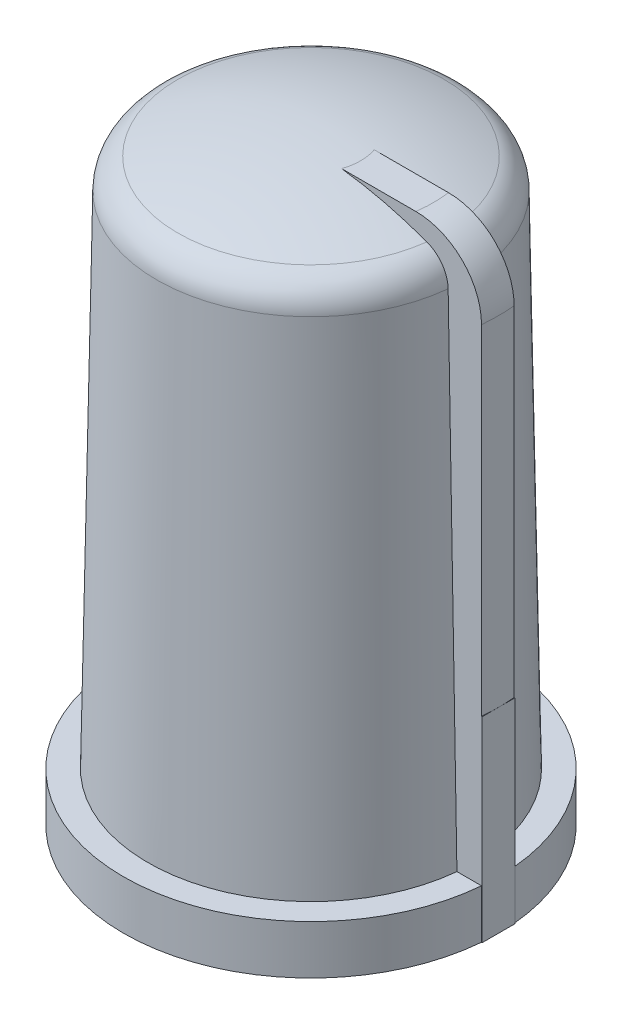
ISO-10303-21;
HEADER;
FILE_DESCRIPTION(('STEP AP214'),'2;1');
FILE_NAME('part.step','',(''),(''),'','','');
FILE_SCHEMA(('AUTOMOTIVE_DESIGN { 1 0 10303 214 1 1 1 1 }'));
ENDSEC;
DATA;
#1=APPLICATION_CONTEXT('core data for automotive mechanical design processes');
#2=APPLICATION_PROTOCOL_DEFINITION('international standard','automotive_design',2000,#1);
#3=PRODUCT_CONTEXT('',#1,'mechanical');
#4=PRODUCT('Part','Part','',(#3));
#5=PRODUCT_RELATED_PRODUCT_CATEGORY('part','',(#4));
#6=PRODUCT_DEFINITION_FORMATION('','',#4);
#7=PRODUCT_DEFINITION_CONTEXT('part definition',#1,'design');
#8=PRODUCT_DEFINITION('design','',#6,#7);
#9=PRODUCT_DEFINITION_SHAPE('','',#8);
#10=(LENGTH_UNIT() NAMED_UNIT(*) SI_UNIT(.MILLI.,.METRE.));
#11=(NAMED_UNIT(*) PLANE_ANGLE_UNIT() SI_UNIT($,.RADIAN.));
#12=(NAMED_UNIT(*) SI_UNIT($,.STERADIAN.) SOLID_ANGLE_UNIT());
#13=UNCERTAINTY_MEASURE_WITH_UNIT(LENGTH_MEASURE(1.E-05),#10,'distance_accuracy_value','');
#14=(GEOMETRIC_REPRESENTATION_CONTEXT(3) GLOBAL_UNCERTAINTY_ASSIGNED_CONTEXT((#13)) GLOBAL_UNIT_ASSIGNED_CONTEXT((#10,
#11,#12)) REPRESENTATION_CONTEXT('',''));
#15=CARTESIAN_POINT('',(0.,0.,0.));
#16=DIRECTION('',(0.,0.,1.));
#17=DIRECTION('',(1.,0.,0.));
#18=AXIS2_PLACEMENT_3D('',#15,#16,#17);
#19=CARTESIAN_POINT('',(0.,1.5,0.));
#20=DIRECTION('',(0.,-1.,0.));
#21=DIRECTION('',(0.,0.,-1.));
#22=AXIS2_PLACEMENT_3D('',#19,#20,#21);
#23=CYLINDRICAL_SURFACE('',#22,5.75);
#24=DIRECTION('',(0.,-1.,0.));
#25=VECTOR('',#24,1.);
#26=CARTESIAN_POINT('',(5.7282196186948,1.5,0.5));
#27=LINE('',#26,#25);
#28=CARTESIAN_POINT('',(5.7282196186948,6.,0.5));
#29=VERTEX_POINT('',#28);
#30=CARTESIAN_POINT('',(5.7282196186948,16.4,0.5));
#31=VERTEX_POINT('',#30);
#32=EDGE_CURVE('E183',#29,#31,#27,.F.);
#33=ORIENTED_EDGE('',*,*,#32,.F.);
#34=CARTESIAN_POINT('',(0.,6.,0.));
#35=DIRECTION('',(0.,1.,0.));
#36=DIRECTION('',(0.,0.,1.));
#37=AXIS2_PLACEMENT_3D('',#34,#35,#36);
#38=CIRCLE('',#37,5.75);
#39=CARTESIAN_POINT('',(5.75,6.,0.));
#40=VERTEX_POINT('',#39);
#41=EDGE_CURVE('E140',#29,#40,#38,.T.);
#42=ORIENTED_EDGE('',*,*,#41,.T.);
#43=CARTESIAN_POINT('',(5.7282196186948,6.,-0.500000000000001));
#44=VERTEX_POINT('',#43);
#45=EDGE_CURVE('E165',#40,#44,#38,.T.);
#46=ORIENTED_EDGE('',*,*,#45,.T.);
#47=DIRECTION('',(0.,-1.,0.));
#48=VECTOR('',#47,1.);
#49=CARTESIAN_POINT('',(5.7282196186948,1.5,-0.500000000000001));
#50=LINE('',#49,#48);
#51=CARTESIAN_POINT('',(5.7282196186948,16.4,-0.500000000000001));
#52=VERTEX_POINT('',#51);
#53=EDGE_CURVE('E180',#52,#44,#50,.T.);
#54=ORIENTED_EDGE('',*,*,#53,.F.);
#55=CARTESIAN_POINT('',(0.,16.4,0.));
#56=DIRECTION('',(0.,-1.,0.));
#57=DIRECTION('',(0.,0.,-1.));
#58=AXIS2_PLACEMENT_3D('',#55,#56,#57);
#59=CIRCLE('',#58,5.75);
#60=EDGE_CURVE('E249',#52,#31,#59,.T.);
#61=ORIENTED_EDGE('',*,*,#60,.T.);
#62=EDGE_LOOP('',(#33,#42,#46,#54,#61));
#63=FACE_BOUND('',#62,.T.);
#64=ADVANCED_FACE('F36',(#63),#23,.T.);
#65=CARTESIAN_POINT('',(0.,1.5,0.));
#66=DIRECTION('',(0.,1.,0.));
#67=DIRECTION('',(0.,0.,1.));
#68=AXIS2_PLACEMENT_3D('',#65,#66,#67);
#69=PLANE('',#68);
#70=CARTESIAN_POINT('',(0.,1.5,0.));
#71=DIRECTION('',(0.,1.,0.));
#72=DIRECTION('',(0.,0.,1.));
#73=AXIS2_PLACEMENT_3D('',#70,#71,#72);
#74=CIRCLE('',#73,5.);
#75=CARTESIAN_POINT('',(4.9749371855331,1.5,-0.500000000000001));
#76=VERTEX_POINT('',#75);
#77=CARTESIAN_POINT('',(4.9749371855331,1.5,0.5));
#78=VERTEX_POINT('',#77);
#79=EDGE_CURVE('E275',#76,#78,#74,.T.);
#80=ORIENTED_EDGE('',*,*,#79,.F.);
#81=DIRECTION('',(-1.,0.,0.));
#82=VECTOR('',#81,1.);
#83=CARTESIAN_POINT('',(5.751,1.5,-0.500000000000001));
#84=LINE('',#83,#82);
#85=CARTESIAN_POINT('',(5.7282196186948,1.5,-0.500000000000001));
#86=VERTEX_POINT('',#85);
#87=EDGE_CURVE('E190',#86,#76,#84,.T.);
#88=ORIENTED_EDGE('',*,*,#87,.F.);
#89=CARTESIAN_POINT('',(0.,1.5,0.));
#90=DIRECTION('',(0.,1.,0.));
#91=DIRECTION('',(0.,0.,1.));
#92=AXIS2_PLACEMENT_3D('',#89,#90,#91);
#93=CIRCLE('',#92,5.75);
#94=CARTESIAN_POINT('',(5.7282196186948,1.5,0.5));
#95=VERTEX_POINT('',#94);
#96=EDGE_CURVE('E266',#86,#95,#93,.T.);
#97=ORIENTED_EDGE('',*,*,#96,.T.);
#98=DIRECTION('',(-1.,0.,0.));
#99=VECTOR('',#98,1.);
#100=CARTESIAN_POINT('',(5.751,1.5,0.5));
#101=LINE('',#100,#99);
#102=EDGE_CURVE('E184',#95,#78,#101,.T.);
#103=ORIENTED_EDGE('',*,*,#102,.T.);
#104=EDGE_LOOP('',(#80,#88,#97,#103));
#105=FACE_BOUND('',#104,.T.);
#106=ADVANCED_FACE('F274',(#105),#69,.T.);
#107=CARTESIAN_POINT('',(0.,6.85740624492644,0.));
#108=DIRECTION('',(0.,0.,1.));
#109=DIRECTION('',(1.,0.,0.));
#110=AXIS2_PLACEMENT_3D('',#107,#108,#109);
#111=SPHERICAL_SURFACE('',#110,11.6425937550736);
#112=CARTESIAN_POINT('',(0.,18.4,0.));
#113=DIRECTION('',(0.,-1.,0.));
#114=DIRECTION('',(0.,0.,-1.));
#115=AXIS2_PLACEMENT_3D('',#112,#113,#114);
#116=CIRCLE('',#115,1.52266829973396);
#117=CARTESIAN_POINT('',(1.43823459526415,18.4,0.500000000000001));
#118=VERTEX_POINT('',#117);
#119=CARTESIAN_POINT('',(1.43823459526415,18.4,-0.499999999999999));
#120=VERTEX_POINT('',#119);
#121=EDGE_CURVE('E323',#118,#120,#116,.F.);
#122=ORIENTED_EDGE('',*,*,#121,.T.);
#123=CARTESIAN_POINT('',(0.,6.85740624492644,-0.5));
#124=DIRECTION('',(0.,0.,1.));
#125=DIRECTION('',(0.,-1.,0.));
#126=AXIS2_PLACEMENT_3D('',#123,#124,#125);
#127=CIRCLE('',#126,11.6318523608958);
#128=CARTESIAN_POINT('',(4.05233596992253,17.7605508616209,-0.499999999999999));
#129=VERTEX_POINT('',#128);
#130=EDGE_CURVE('E223',#120,#129,#127,.F.);
#131=ORIENTED_EDGE('',*,*,#130,.T.);
#132=CARTESIAN_POINT('',(0.,17.7605508616208,0.));
#133=DIRECTION('',(0.,-1.,0.));
#134=DIRECTION('',(0.,0.,-1.));
#135=AXIS2_PLACEMENT_3D('',#132,#133,#134);
#136=CIRCLE('',#135,4.08306585951384);
#137=CARTESIAN_POINT('',(4.05233596992247,17.7605508616208,0.500000000000001));
#138=VERTEX_POINT('',#137);
#139=EDGE_CURVE('E277',#129,#138,#136,.F.);
#140=ORIENTED_EDGE('',*,*,#139,.T.);
#141=CARTESIAN_POINT('',(0.,6.85740624492644,0.5));
#142=DIRECTION('',(0.,0.,-1.));
#143=DIRECTION('',(0.,1.,0.));
#144=AXIS2_PLACEMENT_3D('',#141,#142,#143);
#145=CIRCLE('',#144,11.6318523608958);
#146=EDGE_CURVE('E201',#138,#118,#145,.F.);
#147=ORIENTED_EDGE('',*,*,#146,.T.);
#148=EDGE_LOOP('',(#122,#131,#140,#147));
#149=FACE_BOUND('',#148,.T.);
#150=ADVANCED_FACE('F211',(#149),#111,.T.);
#151=CARTESIAN_POINT('',(0.,1.5,0.));
#152=DIRECTION('',(0.,-1.,0.));
#153=DIRECTION('',(0.,0.,1.));
#154=AXIS2_PLACEMENT_3D('',#151,#152,#153);
#155=CONICAL_SURFACE('',#154,5.,0.0174532925199433);
#156=CARTESIAN_POINT('',(5.11213647618105,-6.32179238394459,-0.500000000000002));
#157=CARTESIAN_POINT('',(5.05507558478364,-3.06830883793409,-0.500000000000002));
#158=CARTESIAN_POINT('',(4.99800588069078,0.185174553540396,-0.500000000000001));
#159=CARTESIAN_POINT('',(4.88384640164953,6.69214098436203,-0.500000000000001));
#160=CARTESIAN_POINT('',(4.82675662670113,9.94562402370917,-0.5));
#161=CARTESIAN_POINT('',(4.58583582832519,23.6727256376006,-0.499999999999999));
#162=CARTESIAN_POINT('',(4.40189939179421,34.1463423620254,-0.499999999999997));
#163=CARTESIAN_POINT('',(4.21780549189549,44.6199563205081,-0.499999999999996));
#164=B_SPLINE_CURVE_WITH_KNOTS('',3,(#156,#157,#158,#159,#160,#161,#162,#163),.UNSPECIFIED.,.F.,
.F.,(4,2,2,4),(0.,9.76195165763268,19.5239033152718,50.9495985185821),.UNSPECIFIED.);
#165=CARTESIAN_POINT('',(4.70572400774219,16.8415156737932,-0.499999999999999));
#166=VERTEX_POINT('',#165);
#167=EDGE_CURVE('E217',#76,#166,#164,.T.);
#168=ORIENTED_EDGE('',*,*,#167,.F.);
#169=ORIENTED_EDGE('',*,*,#79,.T.);
#170=CARTESIAN_POINT('',(5.11213647618105,-6.32179238394459,0.5));
#171=CARTESIAN_POINT('',(5.05507558478364,-3.06830883793409,0.5));
#172=CARTESIAN_POINT('',(4.99800588069078,0.185174553540396,0.5));
#173=CARTESIAN_POINT('',(4.88384640164953,6.69214098436203,0.5));
#174=CARTESIAN_POINT('',(4.82675662670113,9.94562402370917,0.500000000000001));
#175=CARTESIAN_POINT('',(4.58583582832519,23.6727256376006,0.500000000000001));
#176=CARTESIAN_POINT('',(4.40189939179422,34.1463423620254,0.500000000000002));
#177=CARTESIAN_POINT('',(4.21780549189549,44.6199563205081,0.500000000000002));
#178=B_SPLINE_CURVE_WITH_KNOTS('',3,(#170,#171,#172,#173,#174,#175,#176,#177),.UNSPECIFIED.,.F.,
.F.,(4,2,2,4),(0.,9.76195165763268,19.5239033152718,50.9495985185821),.UNSPECIFIED.);
#179=CARTESIAN_POINT('',(4.70572400774881,16.8415156737941,0.500000000000001));
#180=VERTEX_POINT('',#179);
#181=EDGE_CURVE('E186',#180,#78,#178,.F.);
#182=ORIENTED_EDGE('',*,*,#181,.F.);
#183=CARTESIAN_POINT('',(0.,16.8415156737932,0.));
#184=DIRECTION('',(0.,-1.,0.));
#185=DIRECTION('',(0.,0.,-1.));
#186=AXIS2_PLACEMENT_3D('',#183,#184,#185);
#187=CIRCLE('',#186,4.73221284781667);
#188=EDGE_CURVE('E285',#180,#166,#187,.T.);
#189=ORIENTED_EDGE('',*,*,#188,.T.);
#190=EDGE_LOOP('',(#168,#169,#182,#189));
#191=FACE_BOUND('',#190,.T.);
#192=ADVANCED_FACE('F206',(#191),#155,.T.);
#193=CARTESIAN_POINT('',(0.,16.8240632673559,0.));
#194=DIRECTION('',(0.,-1.,0.));
#195=DIRECTION('',(0.,0.,-1.));
#196=AXIS2_PLACEMENT_3D('',#193,#194,#195);
#197=TOROIDAL_SURFACE('',#196,3.73236515266028,1.);
#198=ORIENTED_EDGE('',*,*,#139,.F.);
#199=CARTESIAN_POINT('',(2.78057857531526,17.2447854194287,-0.499999999999999));
#200=CARTESIAN_POINT('',(2.80466606760467,17.2958983743193,-0.499999999999999));
#201=CARTESIAN_POINT('',(2.83313939538233,17.3449938471423,-0.499999999999999));
#202=CARTESIAN_POINT('',(2.89797674637779,17.4377285967747,-0.499999999999999));
#203=CARTESIAN_POINT('',(2.93435164457501,17.4813602218716,-0.499999999999999));
#204=CARTESIAN_POINT('',(3.01384756348374,17.5618811801193,-0.499999999999999));
#205=CARTESIAN_POINT('',(3.05696129721656,17.5987777038573,-0.499999999999999));
#206=CARTESIAN_POINT('',(3.14870640140332,17.6648801335012,-0.499999999999999));
#207=CARTESIAN_POINT('',(3.19733635682632,17.6940880053585,-0.499999999999999));
#208=CARTESIAN_POINT('',(3.29924774918257,17.7442872398531,-0.499999999999999));
#209=CARTESIAN_POINT('',(3.35256922465885,17.7651973482422,-0.499999999999999));
#210=CARTESIAN_POINT('',(3.46195822706605,17.7978223724743,-0.499999999999999));
#211=CARTESIAN_POINT('',(3.51802596875955,17.8095365679578,-0.499999999999999));
#212=CARTESIAN_POINT('',(3.63162054619634,17.8234665975785,-0.499999999999999));
#213=CARTESIAN_POINT('',(3.68915334728403,17.8256338771634,-0.499999999999999));
#214=CARTESIAN_POINT('',(3.80376379956872,17.8202530725995,-0.499999999999999));
#215=CARTESIAN_POINT('',(3.86084145419681,17.8127050617586,-0.499999999999999));
#216=CARTESIAN_POINT('',(3.97275865354866,17.7881109302123,-0.499999999999999));
#217=CARTESIAN_POINT('',(4.02760361514094,17.7710894752027,-0.499999999999999));
#218=CARTESIAN_POINT('',(4.13362736520577,17.7280196732807,-0.499999999999999));
#219=CARTESIAN_POINT('',(4.18480627733729,17.7019716310158,-0.499999999999999));
#220=CARTESIAN_POINT('',(4.28168167657877,17.6417691562521,-0.499999999999999));
#221=CARTESIAN_POINT('',(4.32741215586398,17.6076694265531,-0.499999999999999));
#222=CARTESIAN_POINT('',(4.41244641141516,17.5322254017138,-0.499999999999999));
#223=CARTESIAN_POINT('',(4.45175042533535,17.4908813745889,-0.499999999999999));
#224=CARTESIAN_POINT('',(4.5225197081311,17.4024423498749,-0.499999999999999));
#225=CARTESIAN_POINT('',(4.55403908547462,17.3553906470148,-0.499999999999999));
#226=CARTESIAN_POINT('',(4.60867901470136,17.2566399215756,-0.499999999999999));
#227=CARTESIAN_POINT('',(4.63179984376837,17.2049410524408,-0.499999999999999));
#228=CARTESIAN_POINT('',(4.66885770134196,17.0986756841154,-0.499999999999999));
#229=CARTESIAN_POINT('',(4.68284538348877,17.0441268454007,-0.499999999999999));
#230=CARTESIAN_POINT('',(4.70143328034687,16.9334527353359,-0.499999999999999));
#231=CARTESIAN_POINT('',(4.70603368651887,16.8773274961614,-0.499999999999999));
#232=CARTESIAN_POINT('',(4.70571298785879,16.7652747227166,-0.499999999999999));
#233=CARTESIAN_POINT('',(4.70082062958444,16.7093471037622,-0.499999999999999));
#234=CARTESIAN_POINT('',(4.6817144363306,16.5991079938328,-0.499999999999999));
#235=CARTESIAN_POINT('',(4.6675006587496,16.5447964929083,-0.499999999999999));
#236=CARTESIAN_POINT('',(4.63016694023835,16.4393323774419,-0.499999999999999));
#237=CARTESIAN_POINT('',(4.60704779191601,16.3881794822435,-0.499999999999999));
#238=CARTESIAN_POINT('',(4.55257304484346,16.2904664352984,-0.499999999999999));
#239=CARTESIAN_POINT('',(4.52121737237153,16.243906324665,-0.499999999999999));
#240=CARTESIAN_POINT('',(4.45107209453783,16.156552906789,-0.499999999999999));
#241=CARTESIAN_POINT('',(4.4122616378937,16.1157763459999,-0.499999999999999));
#242=CARTESIAN_POINT('',(4.32837842907052,16.0412756155543,-0.499999999999999));
#243=CARTESIAN_POINT('',(4.28330553178201,16.0075516093607,-0.499999999999999));
#244=CARTESIAN_POINT('',(4.18791989738212,15.9479126378444,-0.499999999999999));
#245=CARTESIAN_POINT('',(4.13758012911819,15.9220409113161,-0.499999999999999));
#246=CARTESIAN_POINT('',(4.03329354175741,15.8790490914934,-0.499999999999999));
#247=CARTESIAN_POINT('',(3.97934659342265,15.8619293119536,-0.499999999999999));
#248=CARTESIAN_POINT('',(3.86897081845608,15.8367981610985,-0.499999999999999));
#249=CARTESIAN_POINT('',(3.8125271675858,15.8288519000213,-0.499999999999999));
#250=CARTESIAN_POINT('',(3.6991050781457,15.8224792358634,-0.499999999999999));
#251=CARTESIAN_POINT('',(3.64212661814322,15.8240532159501,-0.499999999999999));
#252=CARTESIAN_POINT('',(3.52884233968608,15.8366987747461,-0.499999999999999));
#253=CARTESIAN_POINT('',(3.47254368150297,15.8478345472452,-0.499999999999999));
#254=CARTESIAN_POINT('',(3.36260129639441,15.8793677194759,-0.499999999999999));
#255=CARTESIAN_POINT('',(3.30895766150512,15.8997654400232,-0.499999999999999));
#256=CARTESIAN_POINT('',(3.20567772865942,15.9493367931673,-0.499999999999999));
#257=CARTESIAN_POINT('',(3.15605477911956,15.9785382513744,-0.499999999999999));
#258=CARTESIAN_POINT('',(3.06244008884366,16.0448903963541,-0.499999999999999));
#259=CARTESIAN_POINT('',(3.01844832892982,16.0820410560533,-0.499999999999999));
#260=CARTESIAN_POINT('',(2.93756973995263,16.1630936354001,-0.499999999999999));
#261=CARTESIAN_POINT('',(2.90065370398674,16.2069663952498,-0.499999999999999));
#262=CARTESIAN_POINT('',(2.83482399413998,16.3003521330825,-0.499999999999999));
#263=CARTESIAN_POINT('',(2.80590942509358,16.3498644792603,-0.499999999999999));
#264=CARTESIAN_POINT('',(2.75730907483443,16.4524565091756,-0.499999999999999));
#265=CARTESIAN_POINT('',(2.7375104069936,16.5054827060017,-0.499999999999999));
#266=CARTESIAN_POINT('',(2.70724009063921,16.6141490375954,-0.499999999999999));
#267=CARTESIAN_POINT('',(2.69676990672179,16.6697895813791,-0.499999999999999));
#268=CARTESIAN_POINT('',(2.68558665936819,16.7812511246232,-0.499999999999999));
#269=CARTESIAN_POINT('',(2.68473957915904,16.8370587894689,-0.499999999999999));
#270=CARTESIAN_POINT('',(2.69248710889684,16.9479657889576,-0.499999999999999));
#271=CARTESIAN_POINT('',(2.7010696825705,17.0030659359688,-0.499999999999999));
#272=CARTESIAN_POINT('',(2.72207558814261,17.0893270188669,-0.499999999999999));
#273=CARTESIAN_POINT('',(2.73157917539502,17.1212283370364,-0.499999999999999));
#274=CARTESIAN_POINT('',(2.75374154182756,17.1839145654677,-0.499999999999999));
#275=CARTESIAN_POINT('',(2.76640027968741,17.2146994903438,-0.499999999999999));
#276=CARTESIAN_POINT('',(2.78057857531526,17.2447854194287,-0.499999999999999));
#277=B_SPLINE_CURVE_WITH_KNOTS('',3,(#199,#200,#201,#202,#203,#204,#205,#206,#207,#208,#209,
#210,#211,#212,#213,#214,#215,#216,#217,#218,#219,#220,#221,#222,#223,#224,#225,#226,#227,#228,
#229,#230,#231,#232,#233,#234,#235,#236,#237,#238,#239,#240,#241,#242,#243,#244,#245,#246,#247,
#248,#249,#250,#251,#252,#253,#254,#255,#256,#257,#258,#259,#260,#261,#262,#263,#264,#265,#266,
#267,#268,#269,#270,#271,#272,#273,#274,#275,#276),.UNSPECIFIED.,.T.,.F.,(4,2,2,2,2,2,2,2,2,2,2,
2,2,2,2,2,2,2,2,2,2,2,2,2,2,2,2,2,2,2,2,2,2,2,2,2,2,2,4),(0.,0.169389378495487,
0.339013382627668,0.508455218395725,0.677853686522219,0.848872279802771,1.01990426844096,
1.19180510981215,1.3637046540911,1.53515870893485,1.70660697776172,1.87692234953715,
2.04723142153143,2.21632112744793,2.38540525225862,2.55354346409171,2.72167824658231,
2.88930466781874,3.05693005687172,3.22454053014781,3.39215250368703,3.56024030616228,
3.72833200411599,3.89733317780495,4.0663404097095,4.23653995717662,4.40674635482273,
4.57810446042058,4.74946850197786,4.92137994841708,5.09329080937224,5.26447601457778,
5.43564206065854,5.60462735203544,5.77363916986797,5.94029430018683,6.10673695412376,
6.20644364450068,6.30614902917373),.UNSPECIFIED.);
#278=EDGE_CURVE('E235',#129,#166,#277,.T.);
#279=ORIENTED_EDGE('',*,*,#278,.T.);
#280=ORIENTED_EDGE('',*,*,#188,.F.);
#281=CARTESIAN_POINT('',(2.78057857531525,17.2447854194287,0.500000000000001));
#282=CARTESIAN_POINT('',(2.75695876162319,17.19465313063,0.500000000000001));
#283=CARTESIAN_POINT('',(2.73752315545075,17.1425082463049,0.500000000000001));
#284=CARTESIAN_POINT('',(2.7076583230257,17.0356577864794,0.500000000000001));
#285=CARTESIAN_POINT('',(2.69723837008392,16.980949635264,0.500000000000001));
#286=CARTESIAN_POINT('',(2.6857632065473,16.8705635953804,0.500000000000001));
#287=CARTESIAN_POINT('',(2.684706373152,16.8148858764322,0.500000000000001));
#288=CARTESIAN_POINT('',(2.69199024458167,16.704162619309,0.500000000000001));
#289=CARTESIAN_POINT('',(2.70032890492496,16.6491169462318,0.500000000000001));
#290=CARTESIAN_POINT('',(2.72609173328677,16.5413682094179,0.500000000000001));
#291=CARTESIAN_POINT('',(2.74348919539396,16.4886587513485,0.500000000000001));
#292=CARTESIAN_POINT('',(2.78681048067281,16.3868687842722,0.500000000000001));
#293=CARTESIAN_POINT('',(2.81273493195179,16.3377885429237,0.500000000000001));
#294=CARTESIAN_POINT('',(2.87259428200111,16.2441709666299,0.500000000000001));
#295=CARTESIAN_POINT('',(2.90659807598296,16.1996777043003,0.500000000000001));
#296=CARTESIAN_POINT('',(2.98149122992342,16.116923864777,0.500000000000001));
#297=CARTESIAN_POINT('',(3.02238110689305,16.0786637559968,0.500000000000001));
#298=CARTESIAN_POINT('',(3.11054451225925,16.0088637926856,0.500000000000001));
#299=CARTESIAN_POINT('',(3.1579041852803,15.9774327256987,0.500000000000001));
#300=CARTESIAN_POINT('',(3.25718482810972,15.9228695490975,0.500000000000001));
#301=CARTESIAN_POINT('',(3.30910606954836,15.899737934113,0.500000000000001));
#302=CARTESIAN_POINT('',(3.41662823621346,15.8622035260422,0.500000000000001));
#303=CARTESIAN_POINT('',(3.47226208271519,15.8478949675651,0.500000000000001));
#304=CARTESIAN_POINT('',(3.5851415486654,15.8287994075856,0.500000000000001));
#305=CARTESIAN_POINT('',(3.64238720074801,15.8240125990103,0.500000000000001));
#306=CARTESIAN_POINT('',(3.75698492391357,15.8241148441602,0.500000000000001));
#307=CARTESIAN_POINT('',(3.81433698180072,15.8290230328223,0.500000000000001));
#308=CARTESIAN_POINT('',(3.92739245702514,15.848443029348,0.500000000000001));
#309=CARTESIAN_POINT('',(3.98309590389021,15.8629546650982,0.500000000000001));
#310=CARTESIAN_POINT('',(4.09099913417617,15.9011112068814,0.500000000000001));
#311=CARTESIAN_POINT('',(4.14321361520136,15.9247145368667,0.500000000000001));
#312=CARTESIAN_POINT('',(4.24289839060152,15.9804134747005,0.500000000000001));
#313=CARTESIAN_POINT('',(4.2903688543996,16.0125087791256,0.500000000000001));
#314=CARTESIAN_POINT('',(4.37885586130961,16.0840350489045,0.500000000000001));
#315=CARTESIAN_POINT('',(4.41991608028835,16.1234119813295,0.500000000000001));
#316=CARTESIAN_POINT('',(4.49478742933825,16.2085419143488,0.500000000000001));
#317=CARTESIAN_POINT('',(4.52859882965196,16.2542946771415,0.500000000000001));
#318=CARTESIAN_POINT('',(4.58777495931853,16.3505427187152,0.500000000000001));
#319=CARTESIAN_POINT('',(4.61319528589195,16.4010038185588,0.500000000000001));
#320=CARTESIAN_POINT('',(4.65515720008435,16.5054917101355,0.500000000000001));
#321=CARTESIAN_POINT('',(4.67169904157,16.5595183998664,0.500000000000001));
#322=CARTESIAN_POINT('',(4.69536136079344,16.6693286365029,0.500000000000001));
#323=CARTESIAN_POINT('',(4.7025260541896,16.7251026591841,0.500000000000001));
#324=CARTESIAN_POINT('',(4.70736961064786,16.8370607318568,0.500000000000001));
#325=CARTESIAN_POINT('',(4.70504862146126,16.8932447754481,0.500000000000001));
#326=CARTESIAN_POINT('',(4.69100295459439,17.0043113057256,0.500000000000001));
#327=CARTESIAN_POINT('',(4.67929685554735,17.0591961435234,0.500000000000001));
#328=CARTESIAN_POINT('',(4.64684514169818,17.1662242989563,0.500000000000001));
#329=CARTESIAN_POINT('',(4.62609952907895,17.2183676172534,0.500000000000001));
#330=CARTESIAN_POINT('',(4.57614524712518,17.3184931214527,0.500000000000001));
#331=CARTESIAN_POINT('',(4.54692818398221,17.3664711186432,0.500000000000001));
#332=CARTESIAN_POINT('',(4.48088282306107,17.4568648511074,0.500000000000001));
#333=CARTESIAN_POINT('',(4.44405442460261,17.4992805127922,0.500000000000001));
#334=CARTESIAN_POINT('',(4.36368690209614,17.5775261502359,0.500000000000001));
#335=CARTESIAN_POINT('',(4.32012256004312,17.613330220252,0.500000000000001));
#336=CARTESIAN_POINT('',(4.22763218184039,17.6771688143175,0.500000000000001));
#337=CARTESIAN_POINT('',(4.17870598513951,17.7052031056261,0.500000000000001));
#338=CARTESIAN_POINT('',(4.0765611299214,17.7528950209135,0.500000000000001));
#339=CARTESIAN_POINT('',(4.02331789838383,17.7725000092338,0.500000000000001));
#340=CARTESIAN_POINT('',(3.91430955693643,17.8025643767428,0.500000000000001));
#341=CARTESIAN_POINT('',(3.85854434519875,17.8130233863048,0.500000000000001));
#342=CARTESIAN_POINT('',(3.74564281597348,17.8245765902094,0.500000000000001));
#343=CARTESIAN_POINT('',(3.6884994835752,17.8256022458528,0.500000000000001));
#344=CARTESIAN_POINT('',(3.57484430106869,17.8181057416462,0.500000000000001));
#345=CARTESIAN_POINT('',(3.51833245236704,17.8095835605333,0.500000000000001));
#346=CARTESIAN_POINT('',(3.40719577466162,17.7831658277084,0.500000000000001));
#347=CARTESIAN_POINT('',(3.35258381953644,17.7652160946375,0.500000000000001));
#348=CARTESIAN_POINT('',(3.24712712389446,17.7204066285402,0.500000000000001));
#349=CARTESIAN_POINT('',(3.19628340135491,17.693544498511,0.500000000000001));
#350=CARTESIAN_POINT('',(3.09977221207284,17.6316136697682,0.500000000000001));
#351=CARTESIAN_POINT('',(3.05411193478349,17.5965337745652,0.500000000000001));
#352=CARTESIAN_POINT('',(2.96942687418503,17.5191771214615,0.500000000000001));
#353=CARTESIAN_POINT('',(2.93039400847551,17.476909257411,0.500000000000001));
#354=CARTESIAN_POINT('',(2.87280150753393,17.402729937973,0.500000000000001));
#355=CARTESIAN_POINT('',(2.85193469852052,17.3725799878342,0.500000000000001));
#356=CARTESIAN_POINT('',(2.81362885299203,17.3101748856534,0.500000000000001));
#357=CARTESIAN_POINT('',(2.79618980220383,17.2779197423781,0.500000000000001));
#358=CARTESIAN_POINT('',(2.78057857531525,17.2447854194287,0.500000000000001));
#359=B_SPLINE_CURVE_WITH_KNOTS('',3,(#281,#282,#283,#284,#285,#286,#287,#288,#289,#290,#291,
#292,#293,#294,#295,#296,#297,#298,#299,#300,#301,#302,#303,#304,#305,#306,#307,#308,#309,#310,
#311,#312,#313,#314,#315,#316,#317,#318,#319,#320,#321,#322,#323,#324,#325,#326,#327,#328,#329,
#330,#331,#332,#333,#334,#335,#336,#337,#338,#339,#340,#341,#342,#343,#344,#345,#346,#347,#348,
#349,#350,#351,#352,#353,#354,#355,#356,#357,#358),.UNSPECIFIED.,.T.,.F.,(4,2,2,2,2,2,2,2,2,2,2,
2,2,2,2,2,2,2,2,2,2,2,2,2,2,2,2,2,2,2,2,2,2,2,2,2,2,2,4),(0.,0.166121634588824,
0.332413935949493,0.498677415238573,0.664904722187186,0.830644732225908,0.996396953589591,
1.16361681125928,1.3308492294931,1.5005768491205,1.67031458247306,1.84183514629565,
2.01335918538716,2.18522209834842,2.35708193125786,2.52816500989528,2.6992419764569,
2.86909701220275,3.03894571449734,3.20764532913871,3.37634011981638,3.54423657086891,
3.71213040673518,3.87969270052091,4.04725495384287,4.21498380438401,4.38271487373058,
4.55108981838412,4.71946980610306,4.88888646646538,5.05830997333796,5.22896347477826,
5.39961735626105,5.57126291622266,5.74295467798879,5.91488173996667,6.08659759990432,
6.19639411910942,6.30619018111385),.UNSPECIFIED.);
#360=EDGE_CURVE('E287',#180,#138,#359,.T.);
#361=ORIENTED_EDGE('',*,*,#360,.T.);
#362=EDGE_LOOP('',(#198,#279,#280,#361));
#363=FACE_BOUND('',#362,.T.);
#364=ADVANCED_FACE('F210',(#363),#197,.T.);
#365=CARTESIAN_POINT('',(0.,0.,0.));
#366=DIRECTION('',(0.,1.,0.));
#367=DIRECTION('',(0.,0.,1.));
#368=AXIS2_PLACEMENT_3D('',#365,#366,#367);
#369=PLANE('',#368);
#370=DIRECTION('',(1.,0.,0.));
#371=VECTOR('',#370,1.);
#372=CARTESIAN_POINT('',(5.25,0.,0.5));
#373=LINE('',#372,#371);
#374=CARTESIAN_POINT('',(5.7282196186948,0.,0.5));
#375=VERTEX_POINT('',#374);
#376=CARTESIAN_POINT('',(5.75,0.,0.5));
#377=VERTEX_POINT('',#376);
#378=EDGE_CURVE('E142',#375,#377,#373,.T.);
#379=ORIENTED_EDGE('',*,*,#378,.F.);
#380=CARTESIAN_POINT('',(0.,0.,0.));
#381=DIRECTION('',(0.,1.,0.));
#382=DIRECTION('',(0.,0.,1.));
#383=AXIS2_PLACEMENT_3D('',#380,#381,#382);
#384=CIRCLE('',#383,5.75);
#385=CARTESIAN_POINT('',(5.7282196186948,0.,-0.500000000000001));
#386=VERTEX_POINT('',#385);
#387=EDGE_CURVE('E268',#386,#375,#384,.T.);
#388=ORIENTED_EDGE('',*,*,#387,.F.);
#389=DIRECTION('',(1.,0.,0.));
#390=VECTOR('',#389,1.);
#391=CARTESIAN_POINT('',(5.25,0.,-0.500000000000001));
#392=LINE('',#391,#390);
#393=CARTESIAN_POINT('',(5.75,0.,-0.500000000000001));
#394=VERTEX_POINT('',#393);
#395=EDGE_CURVE('E166',#386,#394,#392,.T.);
#396=ORIENTED_EDGE('',*,*,#395,.T.);
#397=DIRECTION('',(0.,0.,-1.));
#398=VECTOR('',#397,1.);
#399=CARTESIAN_POINT('',(5.75,0.,0.5));
#400=LINE('',#399,#398);
#401=EDGE_CURVE('E158',#377,#394,#400,.T.);
#402=ORIENTED_EDGE('',*,*,#401,.F.);
#403=EDGE_LOOP('',(#379,#388,#396,#402));
#404=FACE_BOUND('',#403,.T.);
#405=CARTESIAN_POINT('',(0.,0.,0.));
#406=DIRECTION('',(0.,1.,0.));
#407=DIRECTION('',(0.,0.,1.));
#408=AXIS2_PLACEMENT_3D('',#405,#406,#407);
#409=CIRCLE('',#408,3.);
#410=CARTESIAN_POINT('',(0.,0.,3.));
#411=VERTEX_POINT('',#410);
#412=EDGE_CURVE('E278',#411,#411,#409,.T.);
#413=ORIENTED_EDGE('',*,*,#412,.T.);
#414=EDGE_LOOP('',(#413));
#415=FACE_BOUND('',#414,.T.);
#416=ADVANCED_FACE('F295',(#404,#415),#369,.F.);
#417=ORIENTED_EDGE('',*,*,#96,.F.);
#418=DIRECTION('',(0.,-1.,0.));
#419=VECTOR('',#418,1.);
#420=CARTESIAN_POINT('',(5.7282196186948,1.5,-0.500000000000001));
#421=LINE('',#420,#419);
#422=EDGE_CURVE('E11',#86,#386,#421,.T.);
#423=ORIENTED_EDGE('',*,*,#422,.T.);
#424=ORIENTED_EDGE('',*,*,#387,.T.);
#425=DIRECTION('',(0.,-1.,0.));
#426=VECTOR('',#425,1.);
#427=CARTESIAN_POINT('',(5.7282196186948,1.5,0.5));
#428=LINE('',#427,#426);
#429=EDGE_CURVE('E45',#375,#95,#428,.F.);
#430=ORIENTED_EDGE('',*,*,#429,.T.);
#431=EDGE_LOOP('',(#417,#423,#424,#430));
#432=FACE_BOUND('',#431,.T.);
#433=ADVANCED_FACE('F264',(#432),#23,.T.);
#434=CARTESIAN_POINT('',(0.,1.5,0.));
#435=DIRECTION('',(0.,-1.,0.));
#436=DIRECTION('',(0.,0.,-1.));
#437=AXIS2_PLACEMENT_3D('',#434,#435,#436);
#438=CYLINDRICAL_SURFACE('',#437,3.);
#439=ORIENTED_EDGE('',*,*,#412,.F.);
#440=EDGE_LOOP('',(#439));
#441=FACE_BOUND('',#440,.T.);
#442=DIRECTION('',(0.,-1.,0.));
#443=VECTOR('',#442,1.);
#444=CARTESIAN_POINT('',(2.23606797749979,10.,-2.));
#445=LINE('',#444,#443);
#446=CARTESIAN_POINT('',(2.23606797749979,10.,-2.));
#447=VERTEX_POINT('',#446);
#448=CARTESIAN_POINT('',(2.23606797749979,1.5,-2.));
#449=VERTEX_POINT('',#448);
#450=EDGE_CURVE('E60',#447,#449,#445,.T.);
#451=ORIENTED_EDGE('',*,*,#450,.T.);
#452=CARTESIAN_POINT('',(0.,1.5,0.));
#453=DIRECTION('',(0.,1.,0.));
#454=DIRECTION('',(0.,0.,1.));
#455=AXIS2_PLACEMENT_3D('',#452,#453,#454);
#456=CIRCLE('',#455,3.);
#457=CARTESIAN_POINT('',(-2.23606797749979,1.5,-2.));
#458=VERTEX_POINT('',#457);
#459=EDGE_CURVE('E354',#449,#458,#456,.T.);
#460=ORIENTED_EDGE('',*,*,#459,.T.);
#461=DIRECTION('',(0.,-1.,0.));
#462=VECTOR('',#461,1.);
#463=CARTESIAN_POINT('',(-2.23606797749979,10.,-2.));
#464=LINE('',#463,#462);
#465=CARTESIAN_POINT('',(-2.23606797749979,10.,-2.));
#466=VERTEX_POINT('',#465);
#467=EDGE_CURVE('E177',#466,#458,#464,.T.);
#468=ORIENTED_EDGE('',*,*,#467,.F.);
#469=CARTESIAN_POINT('',(0.,10.,0.));
#470=DIRECTION('',(0.,1.,0.));
#471=DIRECTION('',(0.,0.,1.));
#472=AXIS2_PLACEMENT_3D('',#469,#470,#471);
#473=CIRCLE('',#472,3.);
#474=EDGE_CURVE('E174',#466,#447,#473,.T.);
#475=ORIENTED_EDGE('',*,*,#474,.T.);
#476=EDGE_LOOP('',(#451,#460,#468,#475));
#477=FACE_BOUND('',#476,.T.);
#478=ADVANCED_FACE('F214',(#441,#477),#438,.F.);
#479=CARTESIAN_POINT('',(0.,1.5,0.));
#480=DIRECTION('',(0.,1.,0.));
#481=DIRECTION('',(0.,0.,1.));
#482=AXIS2_PLACEMENT_3D('',#479,#480,#481);
#483=PLANE('',#482);
#484=ORIENTED_EDGE('',*,*,#459,.F.);
#485=DIRECTION('',(-1.,0.,0.));
#486=VECTOR('',#485,1.);
#487=CARTESIAN_POINT('',(0.,1.5,-2.));
#488=LINE('',#487,#486);
#489=EDGE_CURVE('E259',#449,#458,#488,.T.);
#490=ORIENTED_EDGE('',*,*,#489,.T.);
#491=EDGE_LOOP('',(#484,#490));
#492=FACE_BOUND('',#491,.T.);
#493=ADVANCED_FACE('F213',(#492),#483,.F.);
#494=CARTESIAN_POINT('',(5.751,18.4,0.500000000000001));
#495=DIRECTION('',(0.,-1.,0.));
#496=DIRECTION('',(0.,0.,-1.));
#497=AXIS2_PLACEMENT_3D('',#494,#495,#496);
#498=PLANE('',#497);
#499=DIRECTION('',(-1.,0.,0.));
#500=VECTOR('',#499,1.);
#501=CARTESIAN_POINT('',(5.751,18.4,0.500000000000001));
#502=LINE('',#501,#500);
#503=CARTESIAN_POINT('',(3.71651718682963,18.4,0.500000000000001));
#504=VERTEX_POINT('',#503);
#505=EDGE_CURVE('E179',#504,#118,#502,.T.);
#506=ORIENTED_EDGE('',*,*,#505,.F.);
#507=CARTESIAN_POINT('',(0.,18.4,0.));
#508=DIRECTION('',(0.,-1.,0.));
#509=DIRECTION('',(0.,0.,-1.));
#510=AXIS2_PLACEMENT_3D('',#507,#508,#509);
#511=CIRCLE('',#510,3.75);
#512=CARTESIAN_POINT('',(3.71651718682963,18.4,-0.499999999999999));
#513=VERTEX_POINT('',#512);
#514=EDGE_CURVE('E250',#504,#513,#511,.F.);
#515=ORIENTED_EDGE('',*,*,#514,.T.);
#516=DIRECTION('',(-1.,0.,0.));
#517=VECTOR('',#516,1.);
#518=CARTESIAN_POINT('',(5.751,18.4,-0.499999999999999));
#519=LINE('',#518,#517);
#520=EDGE_CURVE('E188',#513,#120,#519,.T.);
#521=ORIENTED_EDGE('',*,*,#520,.T.);
#522=ORIENTED_EDGE('',*,*,#121,.F.);
#523=EDGE_LOOP('',(#506,#515,#521,#522));
#524=FACE_BOUND('',#523,.T.);
#525=ADVANCED_FACE('F229',(#524),#498,.F.);
#526=CARTESIAN_POINT('',(5.751,18.4,-0.499999999999999));
#527=DIRECTION('',(0.,0.,1.));
#528=DIRECTION('',(0.,-1.,0.));
#529=AXIS2_PLACEMENT_3D('',#526,#527,#528);
#530=PLANE('',#529);
#531=ORIENTED_EDGE('',*,*,#53,.T.);
#532=DIRECTION('',(1.,0.,0.));
#533=VECTOR('',#532,1.);
#534=CARTESIAN_POINT('',(5.25,6.,-0.500000000000001));
#535=LINE('',#534,#533);
#536=CARTESIAN_POINT('',(5.75,6.,-0.500000000000001));
#537=VERTEX_POINT('',#536);
#538=EDGE_CURVE('E163',#44,#537,#535,.T.);
#539=ORIENTED_EDGE('',*,*,#538,.T.);
#540=DIRECTION('',(0.,1.,0.));
#541=VECTOR('',#540,1.);
#542=CARTESIAN_POINT('',(5.75,6.,-0.500000000000001));
#543=LINE('',#542,#541);
#544=EDGE_CURVE('E143',#394,#537,#543,.T.);
#545=ORIENTED_EDGE('',*,*,#544,.F.);
#546=ORIENTED_EDGE('',*,*,#395,.F.);
#547=ORIENTED_EDGE('',*,*,#422,.F.);
#548=ORIENTED_EDGE('',*,*,#87,.T.);
#549=ORIENTED_EDGE('',*,*,#167,.T.);
#550=ORIENTED_EDGE('',*,*,#278,.F.);
#551=ORIENTED_EDGE('',*,*,#130,.F.);
#552=ORIENTED_EDGE('',*,*,#520,.F.);
#553=CARTESIAN_POINT('',(3.71651718682963,18.4,-0.499999999999999));
#554=CARTESIAN_POINT('',(3.77343091264891,18.3999996271723,-0.499999999999999));
#555=CARTESIAN_POINT('',(3.83031825156542,18.3976122592388,-0.499999999999999));
#556=CARTESIAN_POINT('',(3.94369196626263,18.3880762969267,-0.499999999999999));
#557=CARTESIAN_POINT('',(4.00017834387258,18.3809277242834,-0.499999999999999));
#558=CARTESIAN_POINT('',(4.16836057724945,18.3523854405571,-0.499999999999999));
#559=CARTESIAN_POINT('',(4.27893759862595,18.3238950747987,-0.499999999999999));
#560=CARTESIAN_POINT('',(4.49374110999932,18.2486977552831,-0.499999999999999));
#561=CARTESIAN_POINT('',(4.59796316606221,18.2019782472611,-0.499999999999999));
#562=CARTESIAN_POINT('',(4.79700384124297,18.0916089432676,-0.499999999999999));
#563=CARTESIAN_POINT('',(4.89182513800377,18.0279639873452,-0.499999999999999));
#564=CARTESIAN_POINT('',(5.0687773455736,17.8859586996125,-0.499999999999999));
#565=CARTESIAN_POINT('',(5.15098100352727,17.8076889759246,-0.499999999999999));
#566=CARTESIAN_POINT('',(5.30101555476231,17.638373746236,-0.499999999999999));
#567=CARTESIAN_POINT('',(5.36884356498102,17.5473256835903,-0.499999999999999));
#568=CARTESIAN_POINT('',(5.48782103227113,17.3555684841155,-0.499999999999999));
#569=CARTESIAN_POINT('',(5.53905312933168,17.2549105523309,-0.499999999999999));
#570=CARTESIAN_POINT('',(5.62380297584342,17.0464267402964,-0.499999999999999));
#571=CARTESIAN_POINT('',(5.65733228517566,16.9386055895357,-0.499999999999999));
#572=CARTESIAN_POINT('',(5.69705059327084,16.7583938642523,-0.499999999999999));
#573=CARTESIAN_POINT('',(5.70873241932835,16.6871663272087,-0.499999999999999));
#574=CARTESIAN_POINT('',(5.7243154008446,16.5439694351911,-0.499999999999999));
#575=CARTESIAN_POINT('',(5.72822776274171,16.472001299372,-0.499999999999999));
#576=CARTESIAN_POINT('',(5.7282196186948,16.4,-0.499999999999999));
#577=B_SPLINE_CURVE_WITH_KNOTS('',3,(#553,#554,#555,#556,#557,#558,#559,#560,#561,#562,#563,
#564,#565,#566,#567,#568,#569,#570,#571,#572,#573,#574,#575,#576),.UNSPECIFIED.,.F.,.F.,(4,2,2,
2,2,2,2,2,2,2,2,4),(0.,0.170638155778948,0.341275532579551,0.682082093017836,1.02312377967176,
1.36406804575103,1.7029661033261,2.04193206335202,2.37918321273668,2.71621386464533,
2.93235883849823,3.14819182433271),.UNSPECIFIED.);
#578=EDGE_CURVE('E242',#513,#52,#577,.T.);
#579=ORIENTED_EDGE('',*,*,#578,.T.);
#580=EDGE_LOOP('',(#531,#539,#545,#546,#547,#548,#549,#550,#551,#552,#579));
#581=FACE_BOUND('',#580,.T.);
#582=ADVANCED_FACE('F225',(#581),#530,.F.);
#583=CARTESIAN_POINT('',(5.751,18.4,0.500000000000001));
#584=DIRECTION('',(0.,0.,-1.));
#585=DIRECTION('',(0.,1.,0.));
#586=AXIS2_PLACEMENT_3D('',#583,#584,#585);
#587=PLANE('',#586);
#588=ORIENTED_EDGE('',*,*,#102,.F.);
#589=ORIENTED_EDGE('',*,*,#429,.F.);
#590=ORIENTED_EDGE('',*,*,#378,.T.);
#591=DIRECTION('',(0.,-1.,0.));
#592=VECTOR('',#591,1.);
#593=CARTESIAN_POINT('',(5.75,6.,0.5));
#594=LINE('',#593,#592);
#595=CARTESIAN_POINT('',(5.75,6.,0.5));
#596=VERTEX_POINT('',#595);
#597=EDGE_CURVE('E149',#596,#377,#594,.T.);
#598=ORIENTED_EDGE('',*,*,#597,.F.);
#599=DIRECTION('',(1.,0.,0.));
#600=VECTOR('',#599,1.);
#601=CARTESIAN_POINT('',(5.25,6.,0.5));
#602=LINE('',#601,#600);
#603=EDGE_CURVE('E52',#29,#596,#602,.T.);
#604=ORIENTED_EDGE('',*,*,#603,.F.);
#605=ORIENTED_EDGE('',*,*,#32,.T.);
#606=CARTESIAN_POINT('',(5.7282196186948,16.4,0.5));
#607=CARTESIAN_POINT('',(5.72821931806463,16.4560973850009,0.5));
#608=CARTESIAN_POINT('',(5.72584896344917,16.5121678590606,0.500000000000001));
#609=CARTESIAN_POINT('',(5.71639315891595,16.6239067454966,0.500000000000001));
#610=CARTESIAN_POINT('',(5.70930795932147,16.6795751790598,0.500000000000001));
#611=CARTESIAN_POINT('',(5.68104990670736,16.845272456801,0.500000000000001));
#612=CARTESIAN_POINT('',(5.6528743982014,16.9541900467747,0.500000000000001));
#613=CARTESIAN_POINT('',(5.57864280112557,17.165743660306,0.500000000000001));
#614=CARTESIAN_POINT('',(5.5325785865168,17.2683768045575,0.500000000000001));
#615=CARTESIAN_POINT('',(5.42389806669484,17.464464656196,0.500000000000001));
#616=CARTESIAN_POINT('',(5.36128427022491,17.5579207517851,0.500000000000001));
#617=CARTESIAN_POINT('',(5.22121018450067,17.7331373507948,0.500000000000001));
#618=CARTESIAN_POINT('',(5.1437313638057,17.8148830309109,0.500000000000001));
#619=CARTESIAN_POINT('',(4.97617709062818,17.9642767088938,0.500000000000001));
#620=CARTESIAN_POINT('',(4.88609938950125,18.0319221847815,0.500000000000001));
#621=CARTESIAN_POINT('',(4.69557437623439,18.1514576136258,0.500000000000001));
#622=CARTESIAN_POINT('',(4.59508941581361,18.2032874835259,0.500000000000001));
#623=CARTESIAN_POINT('',(4.38689277729649,18.2894299676704,0.500000000000001));
#624=CARTESIAN_POINT('',(4.27918441477534,18.3237505573291,0.500000000000001));
#625=CARTESIAN_POINT('',(4.09516028824065,18.3658820337091,0.500000000000001));
#626=CARTESIAN_POINT('',(4.01994558940206,18.3786753494114,0.500000000000001));
#627=CARTESIAN_POINT('',(3.86866864315012,18.3957336932327,0.500000000000001));
#628=CARTESIAN_POINT('',(3.79260782640085,18.4000114066929,0.500000000000001));
#629=CARTESIAN_POINT('',(3.71651718682963,18.4,0.500000000000001));
#630=B_SPLINE_CURVE_WITH_KNOTS('',3,(#606,#607,#608,#609,#610,#611,#612,#613,#614,#615,#616,
#617,#618,#619,#620,#621,#622,#623,#624,#625,#626,#627,#628,#629),.UNSPECIFIED.,.F.,.F.,(4,2,2,
2,2,2,2,2,2,2,2,4),(0.,0.168188657983724,0.336368387110465,0.672145061918141,1.00807444380164,
1.34395293148659,1.6802528943234,2.0166129566519,2.35423537399015,2.69170386791563,
2.92013674223748,3.14822907412903),.UNSPECIFIED.);
#631=EDGE_CURVE('E253',#31,#504,#630,.T.);
#632=ORIENTED_EDGE('',*,*,#631,.T.);
#633=ORIENTED_EDGE('',*,*,#505,.T.);
#634=ORIENTED_EDGE('',*,*,#146,.F.);
#635=ORIENTED_EDGE('',*,*,#360,.F.);
#636=ORIENTED_EDGE('',*,*,#181,.T.);
#637=EDGE_LOOP('',(#588,#589,#590,#598,#604,#605,#632,#633,#634,#635,#636));
#638=FACE_BOUND('',#637,.T.);
#639=ADVANCED_FACE('F156',(#638),#587,.F.);
#640=CARTESIAN_POINT('',(0.,16.4,0.));
#641=DIRECTION('',(0.,-1.,0.));
#642=DIRECTION('',(0.,0.,-1.));
#643=AXIS2_PLACEMENT_3D('',#640,#641,#642);
#644=TOROIDAL_SURFACE('',#643,3.75,2.);
#645=ORIENTED_EDGE('',*,*,#631,.F.);
#646=ORIENTED_EDGE('',*,*,#60,.F.);
#647=ORIENTED_EDGE('',*,*,#578,.F.);
#648=ORIENTED_EDGE('',*,*,#514,.F.);
#649=EDGE_LOOP('',(#645,#646,#647,#648));
#650=FACE_BOUND('',#649,.T.);
#651=ADVANCED_FACE('F38',(#650),#644,.T.);
#652=CARTESIAN_POINT('',(0.,10.,-2.));
#653=DIRECTION('',(0.,0.,-1.));
#654=DIRECTION('',(-1.,0.,0.));
#655=AXIS2_PLACEMENT_3D('',#652,#653,#654);
#656=PLANE('',#655);
#657=ORIENTED_EDGE('',*,*,#450,.F.);
#658=DIRECTION('',(1.,0.,0.));
#659=VECTOR('',#658,1.);
#660=CARTESIAN_POINT('',(0.,10.,-2.));
#661=LINE('',#660,#659);
#662=EDGE_CURVE('E171',#466,#447,#661,.T.);
#663=ORIENTED_EDGE('',*,*,#662,.F.);
#664=ORIENTED_EDGE('',*,*,#467,.T.);
#665=ORIENTED_EDGE('',*,*,#489,.F.);
#666=EDGE_LOOP('',(#657,#663,#664,#665));
#667=FACE_BOUND('',#666,.T.);
#668=ADVANCED_FACE('F344',(#667),#656,.F.);
#669=CARTESIAN_POINT('',(0.,10.,0.));
#670=DIRECTION('',(0.,1.,0.));
#671=DIRECTION('',(0.,0.,1.));
#672=AXIS2_PLACEMENT_3D('',#669,#670,#671);
#673=PLANE('',#672);
#674=ORIENTED_EDGE('',*,*,#662,.T.);
#675=ORIENTED_EDGE('',*,*,#474,.F.);
#676=EDGE_LOOP('',(#674,#675));
#677=FACE_BOUND('',#676,.T.);
#678=ADVANCED_FACE('F342',(#677),#673,.F.);
#679=CARTESIAN_POINT('',(5.75,0.,0.));
#680=DIRECTION('',(-1.,0.,0.));
#681=DIRECTION('',(0.,0.,1.));
#682=AXIS2_PLACEMENT_3D('',#679,#680,#681);
#683=PLANE('',#682);
#684=DIRECTION('',(0.,0.,1.));
#685=VECTOR('',#684,1.);
#686=CARTESIAN_POINT('',(5.75,6.,0.5));
#687=LINE('',#686,#685);
#688=EDGE_CURVE('E152',#537,#40,#687,.T.);
#689=ORIENTED_EDGE('',*,*,#688,.T.);
#690=EDGE_CURVE('E137',#40,#596,#687,.T.);
#691=ORIENTED_EDGE('',*,*,#690,.T.);
#692=ORIENTED_EDGE('',*,*,#597,.T.);
#693=ORIENTED_EDGE('',*,*,#401,.T.);
#694=ORIENTED_EDGE('',*,*,#544,.T.);
#695=EDGE_LOOP('',(#689,#691,#692,#693,#694));
#696=FACE_BOUND('',#695,.T.);
#697=ADVANCED_FACE('F147',(#696),#683,.F.);
#698=CARTESIAN_POINT('',(5.25,6.,0.5));
#699=DIRECTION('',(0.,1.,0.));
#700=DIRECTION('',(0.,0.,1.));
#701=AXIS2_PLACEMENT_3D('',#698,#699,#700);
#702=PLANE('',#701);
#703=ORIENTED_EDGE('',*,*,#41,.F.);
#704=ORIENTED_EDGE('',*,*,#603,.T.);
#705=ORIENTED_EDGE('',*,*,#690,.F.);
#706=EDGE_LOOP('',(#703,#704,#705));
#707=FACE_BOUND('',#706,.T.);
#708=ADVANCED_FACE('F136',(#707),#702,.T.);
#709=ORIENTED_EDGE('',*,*,#45,.F.);
#710=ORIENTED_EDGE('',*,*,#688,.F.);
#711=ORIENTED_EDGE('',*,*,#538,.F.);
#712=EDGE_LOOP('',(#709,#710,#711));
#713=FACE_BOUND('',#712,.T.);
#714=ADVANCED_FACE('F334',(#713),#702,.T.);
#715=CLOSED_SHELL('',(#64,#106,#150,#192,#364,#416,#433,#478,#493,#525,#582,#639,#651,#668,#678,
#697,#708,#714));
#716=MANIFOLD_SOLID_BREP('B2',#715);
#717=ADVANCED_BREP_SHAPE_REPRESENTATION('',(#18,#716),#14);
#718=SHAPE_DEFINITION_REPRESENTATION(#9,#717);
ENDSEC;
END-ISO-10303-21;
